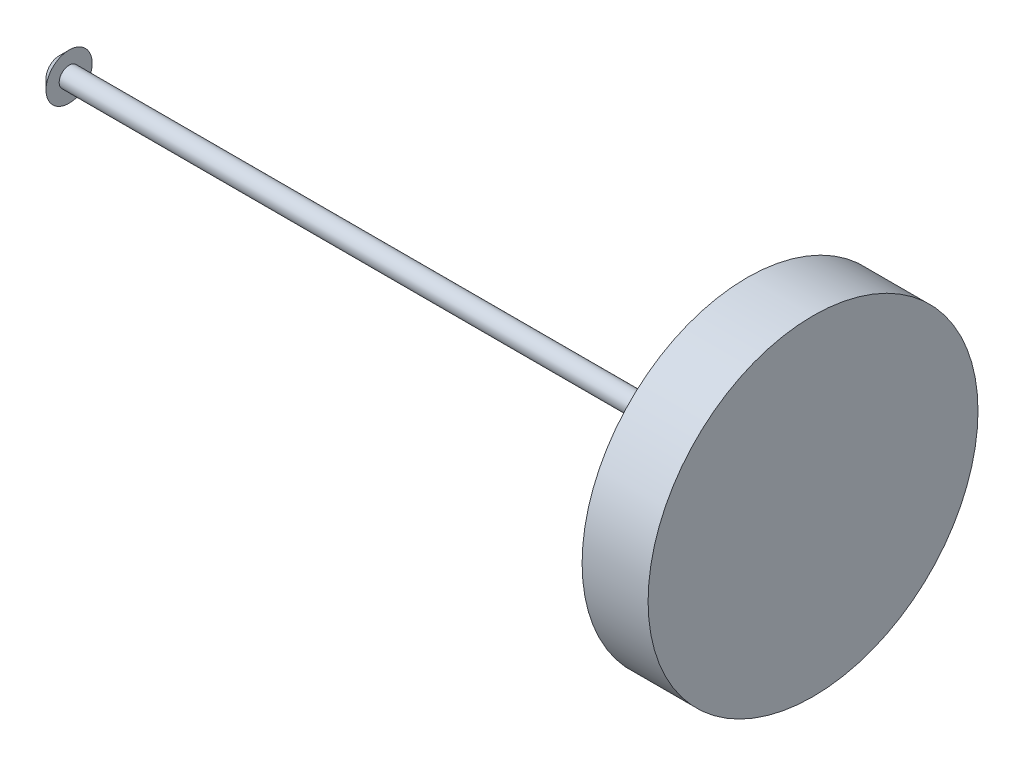
ISO-10303-21;
HEADER;
FILE_DESCRIPTION(('STEP AP214'),'2;1');
FILE_NAME('part.step','',(''),(''),'','','');
FILE_SCHEMA(('AUTOMOTIVE_DESIGN { 1 0 10303 214 1 1 1 1 }'));
ENDSEC;
DATA;
#1=APPLICATION_CONTEXT('core data for automotive mechanical design processes');
#2=APPLICATION_PROTOCOL_DEFINITION('international standard','automotive_design',2000,#1);
#3=PRODUCT_CONTEXT('',#1,'mechanical');
#4=PRODUCT('Part','Part','',(#3));
#5=PRODUCT_RELATED_PRODUCT_CATEGORY('part','',(#4));
#6=PRODUCT_DEFINITION_FORMATION('','',#4);
#7=PRODUCT_DEFINITION_CONTEXT('part definition',#1,'design');
#8=PRODUCT_DEFINITION('design','',#6,#7);
#9=PRODUCT_DEFINITION_SHAPE('','',#8);
#10=(LENGTH_UNIT() NAMED_UNIT(*) SI_UNIT(.MILLI.,.METRE.));
#11=(NAMED_UNIT(*) PLANE_ANGLE_UNIT() SI_UNIT($,.RADIAN.));
#12=(NAMED_UNIT(*) SI_UNIT($,.STERADIAN.) SOLID_ANGLE_UNIT());
#13=UNCERTAINTY_MEASURE_WITH_UNIT(LENGTH_MEASURE(1.E-05),#10,'distance_accuracy_value','');
#14=(GEOMETRIC_REPRESENTATION_CONTEXT(3) GLOBAL_UNCERTAINTY_ASSIGNED_CONTEXT((#13)) GLOBAL_UNIT_ASSIGNED_CONTEXT((#10,
#11,#12)) REPRESENTATION_CONTEXT('',''));
#15=CARTESIAN_POINT('',(0.,0.,0.));
#16=DIRECTION('',(0.,0.,1.));
#17=DIRECTION('',(1.,0.,0.));
#18=AXIS2_PLACEMENT_3D('',#15,#16,#17);
#19=CARTESIAN_POINT('',(-2.75000000000007,0.,-125.));
#20=DIRECTION('',(1.,0.,0.));
#21=DIRECTION('',(0.,0.,-1.));
#22=AXIS2_PLACEMENT_3D('',#19,#20,#21);
#23=PLANE('',#22);
#24=CARTESIAN_POINT('',(-2.75000000000007,0.,-125.));
#25=DIRECTION('',(1.,0.,0.));
#26=DIRECTION('',(0.,0.,-1.));
#27=AXIS2_PLACEMENT_3D('',#24,#25,#26);
#28=CIRCLE('',#27,1.5);
#29=CARTESIAN_POINT('',(-2.75000000000007,0.,-126.5));
#30=VERTEX_POINT('',#29);
#31=EDGE_CURVE('E10',#30,#30,#28,.T.);
#32=ORIENTED_EDGE('',*,*,#31,.F.);
#33=EDGE_LOOP('',(#32));
#34=FACE_BOUND('',#33,.T.);
#35=CARTESIAN_POINT('',(-2.75000000000007,0.,-125.));
#36=DIRECTION('',(-1.,0.,0.));
#37=DIRECTION('',(0.,0.,1.));
#38=AXIS2_PLACEMENT_3D('',#35,#36,#37);
#39=CIRCLE('',#38,3.5);
#40=CARTESIAN_POINT('',(-2.75000000000007,0.,-121.5));
#41=VERTEX_POINT('',#40);
#42=EDGE_CURVE('E55',#41,#41,#39,.T.);
#43=ORIENTED_EDGE('',*,*,#42,.F.);
#44=EDGE_LOOP('',(#43));
#45=FACE_BOUND('',#44,.T.);
#46=ADVANCED_FACE('F41',(#34,#45),#23,.T.);
#47=CARTESIAN_POINT('',(99.9999999999999,0.,-125.));
#48=DIRECTION('',(-1.,0.,0.));
#49=DIRECTION('',(0.,0.,1.));
#50=AXIS2_PLACEMENT_3D('',#47,#48,#49);
#51=CYLINDRICAL_SURFACE('',#50,1.5);
#52=CARTESIAN_POINT('',(99.9999999999999,0.,-125.));
#53=DIRECTION('',(1.,0.,0.));
#54=DIRECTION('',(0.,0.,-1.));
#55=AXIS2_PLACEMENT_3D('',#52,#53,#54);
#56=CIRCLE('',#55,1.5);
#57=CARTESIAN_POINT('',(99.9999999999999,0.,-126.5));
#58=VERTEX_POINT('',#57);
#59=EDGE_CURVE('E47',#58,#58,#56,.T.);
#60=ORIENTED_EDGE('',*,*,#59,.F.);
#61=EDGE_LOOP('',(#60));
#62=FACE_BOUND('',#61,.T.);
#63=ORIENTED_EDGE('',*,*,#31,.T.);
#64=EDGE_LOOP('',(#63));
#65=FACE_BOUND('',#64,.T.);
#66=ADVANCED_FACE('F90',(#62,#65),#51,.T.);
#67=CARTESIAN_POINT('',(-4.25000000000007,0.,-125.));
#68=DIRECTION('',(1.,0.,0.));
#69=DIRECTION('',(0.,0.,-1.));
#70=AXIS2_PLACEMENT_3D('',#67,#68,#69);
#71=CONICAL_SURFACE('',#70,2.00000000000003,0.785398163397439);
#72=ORIENTED_EDGE('',*,*,#42,.T.);
#73=EDGE_LOOP('',(#72));
#74=FACE_BOUND('',#73,.T.);
#75=CARTESIAN_POINT('',(-4.25000000000007,0.,-125.));
#76=DIRECTION('',(-1.,0.,0.));
#77=DIRECTION('',(0.,0.,1.));
#78=AXIS2_PLACEMENT_3D('',#75,#76,#77);
#79=CIRCLE('',#78,2.00000000000003);
#80=CARTESIAN_POINT('',(-4.25000000000007,0.,-123.));
#81=VERTEX_POINT('',#80);
#82=EDGE_CURVE('E51',#81,#81,#79,.T.);
#83=ORIENTED_EDGE('',*,*,#82,.F.);
#84=EDGE_LOOP('',(#83));
#85=FACE_BOUND('',#84,.T.);
#86=ADVANCED_FACE('F96',(#74,#85),#71,.T.);
#87=CARTESIAN_POINT('',(-4.25000000000007,0.,-125.));
#88=DIRECTION('',(1.,0.,0.));
#89=DIRECTION('',(0.,0.,-1.));
#90=AXIS2_PLACEMENT_3D('',#87,#88,#89);
#91=PLANE('',#90);
#92=CARTESIAN_POINT('',(-4.25000000000007,1.00000000000001,-125.));
#93=DIRECTION('',(-1.,0.,0.));
#94=DIRECTION('',(0.,0.,1.));
#95=AXIS2_PLACEMENT_3D('',#92,#93,#94);
#96=CIRCLE('',#95,0.25);
#97=CARTESIAN_POINT('',(-4.25000000000007,1.00000000000001,-124.75));
#98=VERTEX_POINT('',#97);
#99=EDGE_CURVE('E61',#98,#98,#96,.T.);
#100=ORIENTED_EDGE('',*,*,#99,.F.);
#101=EDGE_LOOP('',(#100));
#102=FACE_BOUND('',#101,.T.);
#103=ORIENTED_EDGE('',*,*,#82,.T.);
#104=EDGE_LOOP('',(#103));
#105=FACE_BOUND('',#104,.T.);
#106=ADVANCED_FACE('F104',(#102,#105),#91,.F.);
#107=CARTESIAN_POINT('',(-3.25000000000007,1.00000000000001,-125.));
#108=DIRECTION('',(-1.,0.,0.));
#109=DIRECTION('',(0.,0.,1.));
#110=AXIS2_PLACEMENT_3D('',#107,#108,#109);
#111=CYLINDRICAL_SURFACE('',#110,0.25);
#112=CARTESIAN_POINT('',(-3.25000000000007,1.00000000000001,-125.));
#113=DIRECTION('',(-1.,0.,0.));
#114=DIRECTION('',(0.,0.,1.));
#115=AXIS2_PLACEMENT_3D('',#112,#113,#114);
#116=CIRCLE('',#115,0.25);
#117=CARTESIAN_POINT('',(-3.25000000000007,1.00000000000001,-124.75));
#118=VERTEX_POINT('',#117);
#119=EDGE_CURVE('E60',#118,#118,#116,.T.);
#120=ORIENTED_EDGE('',*,*,#119,.F.);
#121=EDGE_LOOP('',(#120));
#122=FACE_BOUND('',#121,.T.);
#123=ORIENTED_EDGE('',*,*,#99,.T.);
#124=EDGE_LOOP('',(#123));
#125=FACE_BOUND('',#124,.T.);
#126=ADVANCED_FACE('F109',(#122,#125),#111,.F.);
#127=CARTESIAN_POINT('',(-3.25000000000007,1.00000000000001,-125.));
#128=DIRECTION('',(-1.,0.,0.));
#129=DIRECTION('',(0.,0.,1.));
#130=AXIS2_PLACEMENT_3D('',#127,#128,#129);
#131=PLANE('',#130);
#132=ORIENTED_EDGE('',*,*,#119,.T.);
#133=EDGE_LOOP('',(#132));
#134=FACE_BOUND('',#133,.T.);
#135=ADVANCED_FACE('F78',(#134),#131,.T.);
#136=CARTESIAN_POINT('',(110.,0.,-125.));
#137=DIRECTION('',(-1.,0.,0.));
#138=DIRECTION('',(0.,0.,1.));
#139=AXIS2_PLACEMENT_3D('',#136,#137,#138);
#140=CYLINDRICAL_SURFACE('',#139,25.);
#141=CARTESIAN_POINT('',(110.,0.,-125.));
#142=DIRECTION('',(1.,0.,0.));
#143=DIRECTION('',(0.,0.,-1.));
#144=AXIS2_PLACEMENT_3D('',#141,#142,#143);
#145=CIRCLE('',#144,25.);
#146=CARTESIAN_POINT('',(110.,0.,-150.));
#147=VERTEX_POINT('',#146);
#148=EDGE_CURVE('E64',#147,#147,#145,.T.);
#149=ORIENTED_EDGE('',*,*,#148,.F.);
#150=EDGE_LOOP('',(#149));
#151=FACE_BOUND('',#150,.T.);
#152=CARTESIAN_POINT('',(99.9999999999999,0.,-125.));
#153=DIRECTION('',(1.,0.,0.));
#154=DIRECTION('',(0.,0.,-1.));
#155=AXIS2_PLACEMENT_3D('',#152,#153,#154);
#156=CIRCLE('',#155,25.);
#157=CARTESIAN_POINT('',(99.9999999999999,0.,-150.));
#158=VERTEX_POINT('',#157);
#159=EDGE_CURVE('E67',#158,#158,#156,.T.);
#160=ORIENTED_EDGE('',*,*,#159,.T.);
#161=EDGE_LOOP('',(#160));
#162=FACE_BOUND('',#161,.T.);
#163=ADVANCED_FACE('F75',(#151,#162),#140,.T.);
#164=CARTESIAN_POINT('',(110.,0.,-125.));
#165=DIRECTION('',(1.,0.,0.));
#166=DIRECTION('',(0.,0.,-1.));
#167=AXIS2_PLACEMENT_3D('',#164,#165,#166);
#168=PLANE('',#167);
#169=ORIENTED_EDGE('',*,*,#148,.T.);
#170=EDGE_LOOP('',(#169));
#171=FACE_BOUND('',#170,.T.);
#172=ADVANCED_FACE('F73',(#171),#168,.T.);
#173=CARTESIAN_POINT('',(99.9999999999999,0.,-125.));
#174=DIRECTION('',(1.,0.,0.));
#175=DIRECTION('',(0.,0.,-1.));
#176=AXIS2_PLACEMENT_3D('',#173,#174,#175);
#177=PLANE('',#176);
#178=ORIENTED_EDGE('',*,*,#59,.T.);
#179=EDGE_LOOP('',(#178));
#180=FACE_BOUND('',#179,.T.);
#181=ORIENTED_EDGE('',*,*,#159,.F.);
#182=EDGE_LOOP('',(#181));
#183=FACE_BOUND('',#182,.T.);
#184=ADVANCED_FACE('F82',(#180,#183),#177,.F.);
#185=CLOSED_SHELL('',(#46,#66,#86,#106,#126,#135,#163,#172,#184));
#186=MANIFOLD_SOLID_BREP('B2',#185);
#187=ADVANCED_BREP_SHAPE_REPRESENTATION('',(#18,#186),#14);
#188=SHAPE_DEFINITION_REPRESENTATION(#9,#187);
ENDSEC;
END-ISO-10303-21;
